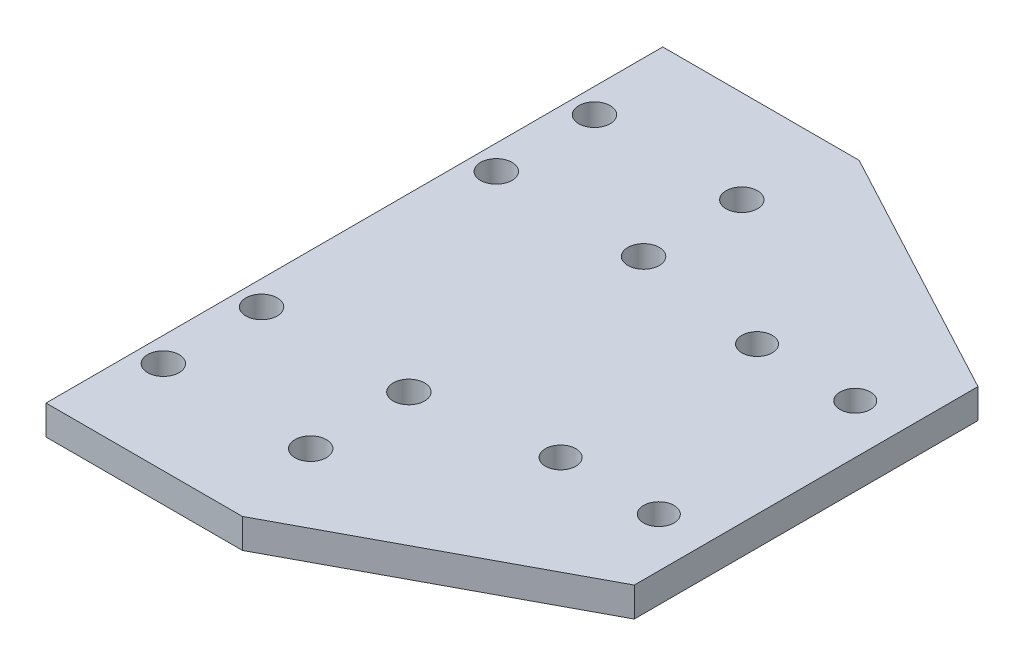
ISO-10303-21;
HEADER;
FILE_DESCRIPTION(('STEP AP214'),'2;1');
FILE_NAME('part.step','',(''),(''),'','','');
FILE_SCHEMA(('AUTOMOTIVE_DESIGN { 1 0 10303 214 1 1 1 1 }'));
ENDSEC;
DATA;
#1=APPLICATION_CONTEXT('core data for automotive mechanical design processes');
#2=APPLICATION_PROTOCOL_DEFINITION('international standard','automotive_design',2000,#1);
#3=PRODUCT_CONTEXT('',#1,'mechanical');
#4=PRODUCT('Part','Part','',(#3));
#5=PRODUCT_RELATED_PRODUCT_CATEGORY('part','',(#4));
#6=PRODUCT_DEFINITION_FORMATION('','',#4);
#7=PRODUCT_DEFINITION_CONTEXT('part definition',#1,'design');
#8=PRODUCT_DEFINITION('design','',#6,#7);
#9=PRODUCT_DEFINITION_SHAPE('','',#8);
#10=(LENGTH_UNIT() NAMED_UNIT(*) SI_UNIT(.MILLI.,.METRE.));
#11=(NAMED_UNIT(*) PLANE_ANGLE_UNIT() SI_UNIT($,.RADIAN.));
#12=(NAMED_UNIT(*) SI_UNIT($,.STERADIAN.) SOLID_ANGLE_UNIT());
#13=UNCERTAINTY_MEASURE_WITH_UNIT(LENGTH_MEASURE(1.E-05),#10,'distance_accuracy_value','');
#14=(GEOMETRIC_REPRESENTATION_CONTEXT(3) GLOBAL_UNCERTAINTY_ASSIGNED_CONTEXT((#13)) GLOBAL_UNIT_ASSIGNED_CONTEXT((#10,
#11,#12)) REPRESENTATION_CONTEXT('',''));
#15=CARTESIAN_POINT('',(0.,0.,0.));
#16=DIRECTION('',(0.,0.,1.));
#17=DIRECTION('',(1.,0.,0.));
#18=AXIS2_PLACEMENT_3D('',#15,#16,#17);
#19=CARTESIAN_POINT('',(-50.,3.,0.));
#20=DIRECTION('',(-1.,0.,0.));
#21=DIRECTION('',(0.,0.,1.));
#22=AXIS2_PLACEMENT_3D('',#19,#20,#21);
#23=PLANE('',#22);
#24=DIRECTION('',(0.,0.,-1.));
#25=VECTOR('',#24,1.);
#26=CARTESIAN_POINT('',(-50.,0.,0.));
#27=LINE('',#26,#25);
#28=CARTESIAN_POINT('',(-50.,0.,31.4));
#29=VERTEX_POINT('',#28);
#30=CARTESIAN_POINT('',(-50.,0.,-31.4));
#31=VERTEX_POINT('',#30);
#32=EDGE_CURVE('E184',#29,#31,#27,.T.);
#33=ORIENTED_EDGE('',*,*,#32,.F.);
#34=DIRECTION('',(0.,-1.,0.));
#35=VECTOR('',#34,1.);
#36=CARTESIAN_POINT('',(-50.,3.,31.4));
#37=LINE('',#36,#35);
#38=CARTESIAN_POINT('',(-50.,3.,31.4));
#39=VERTEX_POINT('',#38);
#40=EDGE_CURVE('E11',#39,#29,#37,.T.);
#41=ORIENTED_EDGE('',*,*,#40,.F.);
#42=DIRECTION('',(0.,0.,-1.));
#43=VECTOR('',#42,1.);
#44=CARTESIAN_POINT('',(-50.,3.,0.));
#45=LINE('',#44,#43);
#46=CARTESIAN_POINT('',(-50.,3.,-31.4));
#47=VERTEX_POINT('',#46);
#48=EDGE_CURVE('E538',#39,#47,#45,.T.);
#49=ORIENTED_EDGE('',*,*,#48,.T.);
#50=DIRECTION('',(0.,-1.,0.));
#51=VECTOR('',#50,1.);
#52=CARTESIAN_POINT('',(-50.,3.,-31.4));
#53=LINE('',#52,#51);
#54=EDGE_CURVE('E66',#47,#31,#53,.T.);
#55=ORIENTED_EDGE('',*,*,#54,.T.);
#56=EDGE_LOOP('',(#33,#41,#49,#55));
#57=FACE_BOUND('',#56,.T.);
#58=ADVANCED_FACE('F48',(#57),#23,.T.);
#59=CARTESIAN_POINT('',(0.,3.,31.4));
#60=DIRECTION('',(0.,0.,-1.));
#61=DIRECTION('',(-1.,0.,0.));
#62=AXIS2_PLACEMENT_3D('',#59,#60,#61);
#63=PLANE('',#62);
#64=DIRECTION('',(1.,0.,0.));
#65=VECTOR('',#64,1.);
#66=CARTESIAN_POINT('',(0.,0.,31.4));
#67=LINE('',#66,#65);
#68=CARTESIAN_POINT('',(-30.,0.,31.4));
#69=VERTEX_POINT('',#68);
#70=EDGE_CURVE('E187',#29,#69,#67,.T.);
#71=ORIENTED_EDGE('',*,*,#70,.T.);
#72=DIRECTION('',(0.,-1.,0.));
#73=VECTOR('',#72,1.);
#74=CARTESIAN_POINT('',(-30.,3.,31.4));
#75=LINE('',#74,#73);
#76=CARTESIAN_POINT('',(-30.,3.,31.4));
#77=VERTEX_POINT('',#76);
#78=EDGE_CURVE('E58',#77,#69,#75,.T.);
#79=ORIENTED_EDGE('',*,*,#78,.F.);
#80=DIRECTION('',(1.,0.,0.));
#81=VECTOR('',#80,1.);
#82=CARTESIAN_POINT('',(0.,3.,31.4));
#83=LINE('',#82,#81);
#84=EDGE_CURVE('E542',#39,#77,#83,.T.);
#85=ORIENTED_EDGE('',*,*,#84,.F.);
#86=ORIENTED_EDGE('',*,*,#40,.T.);
#87=EDGE_LOOP('',(#71,#79,#85,#86));
#88=FACE_BOUND('',#87,.T.);
#89=ADVANCED_FACE('F249',(#88),#63,.F.);
#90=CARTESIAN_POINT('',(6.38701809689258,3.,11.9469403251228));
#91=DIRECTION('',(0.471468241051821,0.,0.881883040816356));
#92=DIRECTION('',(0.881883040816356,0.,-0.471468241051821));
#93=AXIS2_PLACEMENT_3D('',#90,#91,#92);
#94=PLANE('',#93);
#95=DIRECTION('',(-0.881883040816356,0.,0.471468241051821));
#96=VECTOR('',#95,1.);
#97=CARTESIAN_POINT('',(6.38701809689258,0.,11.9469403251228));
#98=LINE('',#97,#96);
#99=CARTESIAN_POINT('',(-4.,0.,17.5));
#100=VERTEX_POINT('',#99);
#101=EDGE_CURVE('E191',#100,#69,#98,.T.);
#102=ORIENTED_EDGE('',*,*,#101,.F.);
#103=DIRECTION('',(0.,-1.,0.));
#104=VECTOR('',#103,1.);
#105=CARTESIAN_POINT('',(-4.,3.,17.5));
#106=LINE('',#105,#104);
#107=CARTESIAN_POINT('',(-4.,3.,17.5));
#108=VERTEX_POINT('',#107);
#109=EDGE_CURVE('E114',#108,#100,#106,.T.);
#110=ORIENTED_EDGE('',*,*,#109,.F.);
#111=DIRECTION('',(-0.881883040816356,0.,0.471468241051821));
#112=VECTOR('',#111,1.);
#113=CARTESIAN_POINT('',(6.38701809689258,3.,11.9469403251228));
#114=LINE('',#113,#112);
#115=EDGE_CURVE('E125',#108,#77,#114,.T.);
#116=ORIENTED_EDGE('',*,*,#115,.T.);
#117=ORIENTED_EDGE('',*,*,#78,.T.);
#118=EDGE_LOOP('',(#102,#110,#116,#117));
#119=FACE_BOUND('',#118,.T.);
#120=ADVANCED_FACE('F246',(#119),#94,.T.);
#121=CARTESIAN_POINT('',(-4.,3.,0.));
#122=DIRECTION('',(1.,0.,0.));
#123=DIRECTION('',(0.,0.,-1.));
#124=AXIS2_PLACEMENT_3D('',#121,#122,#123);
#125=PLANE('',#124);
#126=DIRECTION('',(0.,0.,1.));
#127=VECTOR('',#126,1.);
#128=CARTESIAN_POINT('',(-4.,0.,0.));
#129=LINE('',#128,#127);
#130=CARTESIAN_POINT('',(-4.,0.,-17.5));
#131=VERTEX_POINT('',#130);
#132=EDGE_CURVE('E109',#131,#100,#129,.T.);
#133=ORIENTED_EDGE('',*,*,#132,.F.);
#134=DIRECTION('',(0.,-1.,0.));
#135=VECTOR('',#134,1.);
#136=CARTESIAN_POINT('',(-4.,3.,-17.5));
#137=LINE('',#136,#135);
#138=CARTESIAN_POINT('',(-4.,3.,-17.5));
#139=VERTEX_POINT('',#138);
#140=EDGE_CURVE('E104',#139,#131,#137,.T.);
#141=ORIENTED_EDGE('',*,*,#140,.F.);
#142=DIRECTION('',(0.,0.,1.));
#143=VECTOR('',#142,1.);
#144=CARTESIAN_POINT('',(-4.,3.,0.));
#145=LINE('',#144,#143);
#146=EDGE_CURVE('E107',#139,#108,#145,.T.);
#147=ORIENTED_EDGE('',*,*,#146,.T.);
#148=ORIENTED_EDGE('',*,*,#109,.T.);
#149=EDGE_LOOP('',(#133,#141,#147,#148));
#150=FACE_BOUND('',#149,.T.);
#151=ADVANCED_FACE('F106',(#150),#125,.T.);
#152=CARTESIAN_POINT('',(6.38701809689258,3.,-11.9469403251228));
#153=DIRECTION('',(0.471468241051821,0.,-0.881883040816356));
#154=DIRECTION('',(-0.881883040816356,0.,-0.471468241051821));
#155=AXIS2_PLACEMENT_3D('',#152,#153,#154);
#156=PLANE('',#155);
#157=DIRECTION('',(0.881883040816356,0.,0.471468241051821));
#158=VECTOR('',#157,1.);
#159=CARTESIAN_POINT('',(6.38701809689258,0.,-11.9469403251228));
#160=LINE('',#159,#158);
#161=CARTESIAN_POINT('',(-30.,0.,-31.4));
#162=VERTEX_POINT('',#161);
#163=EDGE_CURVE('E197',#162,#131,#160,.T.);
#164=ORIENTED_EDGE('',*,*,#163,.F.);
#165=DIRECTION('',(0.,-1.,0.));
#166=VECTOR('',#165,1.);
#167=CARTESIAN_POINT('',(-30.,3.,-31.4));
#168=LINE('',#167,#166);
#169=CARTESIAN_POINT('',(-30.,3.,-31.4));
#170=VERTEX_POINT('',#169);
#171=EDGE_CURVE('E85',#170,#162,#168,.T.);
#172=ORIENTED_EDGE('',*,*,#171,.F.);
#173=DIRECTION('',(0.881883040816356,0.,0.471468241051821));
#174=VECTOR('',#173,1.);
#175=CARTESIAN_POINT('',(6.38701809689258,3.,-11.9469403251228));
#176=LINE('',#175,#174);
#177=EDGE_CURVE('E123',#170,#139,#176,.T.);
#178=ORIENTED_EDGE('',*,*,#177,.T.);
#179=ORIENTED_EDGE('',*,*,#140,.T.);
#180=EDGE_LOOP('',(#164,#172,#178,#179));
#181=FACE_BOUND('',#180,.T.);
#182=ADVANCED_FACE('F128',(#181),#156,.T.);
#183=CARTESIAN_POINT('',(-47.5,3.,21.95));
#184=DIRECTION('',(0.,-1.,0.));
#185=DIRECTION('',(0.,0.,-1.));
#186=AXIS2_PLACEMENT_3D('',#183,#184,#185);
#187=CYLINDRICAL_SURFACE('',#186,1.6);
#188=CARTESIAN_POINT('',(-47.5,3.,21.95));
#189=DIRECTION('',(0.,1.,0.));
#190=DIRECTION('',(0.,0.,1.));
#191=AXIS2_PLACEMENT_3D('',#188,#189,#190);
#192=CIRCLE('',#191,1.6);
#193=CARTESIAN_POINT('',(-47.5,3.,23.55));
#194=VERTEX_POINT('',#193);
#195=EDGE_CURVE('E160',#194,#194,#192,.F.);
#196=ORIENTED_EDGE('',*,*,#195,.F.);
#197=EDGE_LOOP('',(#196));
#198=FACE_BOUND('',#197,.T.);
#199=CARTESIAN_POINT('',(-47.5,0.,21.95));
#200=DIRECTION('',(0.,1.,0.));
#201=DIRECTION('',(0.,0.,1.));
#202=AXIS2_PLACEMENT_3D('',#199,#200,#201);
#203=CIRCLE('',#202,1.6);
#204=CARTESIAN_POINT('',(-47.5,0.,23.55));
#205=VERTEX_POINT('',#204);
#206=EDGE_CURVE('E228',#205,#205,#203,.F.);
#207=ORIENTED_EDGE('',*,*,#206,.T.);
#208=EDGE_LOOP('',(#207));
#209=FACE_BOUND('',#208,.T.);
#210=ADVANCED_FACE('F312',(#198,#209),#187,.F.);
#211=CARTESIAN_POINT('',(-47.5,3.,11.95));
#212=DIRECTION('',(0.,-1.,0.));
#213=DIRECTION('',(0.,0.,-1.));
#214=AXIS2_PLACEMENT_3D('',#211,#212,#213);
#215=CYLINDRICAL_SURFACE('',#214,1.6);
#216=CARTESIAN_POINT('',(-47.5,3.,11.95));
#217=DIRECTION('',(0.,1.,0.));
#218=DIRECTION('',(0.,0.,1.));
#219=AXIS2_PLACEMENT_3D('',#216,#217,#218);
#220=CIRCLE('',#219,1.6);
#221=CARTESIAN_POINT('',(-47.5,3.,13.55));
#222=VERTEX_POINT('',#221);
#223=EDGE_CURVE('E156',#222,#222,#220,.F.);
#224=ORIENTED_EDGE('',*,*,#223,.F.);
#225=EDGE_LOOP('',(#224));
#226=FACE_BOUND('',#225,.T.);
#227=CARTESIAN_POINT('',(-47.5,0.,11.95));
#228=DIRECTION('',(0.,1.,0.));
#229=DIRECTION('',(0.,0.,1.));
#230=AXIS2_PLACEMENT_3D('',#227,#228,#229);
#231=CIRCLE('',#230,1.6);
#232=CARTESIAN_POINT('',(-47.5,0.,13.55));
#233=VERTEX_POINT('',#232);
#234=EDGE_CURVE('E224',#233,#233,#231,.F.);
#235=ORIENTED_EDGE('',*,*,#234,.T.);
#236=EDGE_LOOP('',(#235));
#237=FACE_BOUND('',#236,.T.);
#238=ADVANCED_FACE('F315',(#226,#237),#215,.F.);
#239=CARTESIAN_POINT('',(-32.5,3.,11.95));
#240=DIRECTION('',(0.,-1.,0.));
#241=DIRECTION('',(0.,0.,-1.));
#242=AXIS2_PLACEMENT_3D('',#239,#240,#241);
#243=CYLINDRICAL_SURFACE('',#242,1.6);
#244=CARTESIAN_POINT('',(-32.5,3.,11.95));
#245=DIRECTION('',(0.,1.,0.));
#246=DIRECTION('',(0.,0.,1.));
#247=AXIS2_PLACEMENT_3D('',#244,#245,#246);
#248=CIRCLE('',#247,1.6);
#249=CARTESIAN_POINT('',(-32.5,3.,13.55));
#250=VERTEX_POINT('',#249);
#251=EDGE_CURVE('E152',#250,#250,#248,.F.);
#252=ORIENTED_EDGE('',*,*,#251,.F.);
#253=EDGE_LOOP('',(#252));
#254=FACE_BOUND('',#253,.T.);
#255=CARTESIAN_POINT('',(-32.5,0.,11.95));
#256=DIRECTION('',(0.,1.,0.));
#257=DIRECTION('',(0.,0.,1.));
#258=AXIS2_PLACEMENT_3D('',#255,#256,#257);
#259=CIRCLE('',#258,1.6);
#260=CARTESIAN_POINT('',(-32.5,0.,13.55));
#261=VERTEX_POINT('',#260);
#262=EDGE_CURVE('E220',#261,#261,#259,.F.);
#263=ORIENTED_EDGE('',*,*,#262,.T.);
#264=EDGE_LOOP('',(#263));
#265=FACE_BOUND('',#264,.T.);
#266=ADVANCED_FACE('F319',(#254,#265),#243,.F.);
#267=CARTESIAN_POINT('',(-32.5,3.,-11.95));
#268=DIRECTION('',(0.,-1.,0.));
#269=DIRECTION('',(0.,0.,-1.));
#270=AXIS2_PLACEMENT_3D('',#267,#268,#269);
#271=CYLINDRICAL_SURFACE('',#270,1.6);
#272=CARTESIAN_POINT('',(-32.5,3.,-11.95));
#273=DIRECTION('',(0.,1.,0.));
#274=DIRECTION('',(0.,0.,1.));
#275=AXIS2_PLACEMENT_3D('',#272,#273,#274);
#276=CIRCLE('',#275,1.6);
#277=CARTESIAN_POINT('',(-32.5,3.,-10.35));
#278=VERTEX_POINT('',#277);
#279=EDGE_CURVE('E148',#278,#278,#276,.T.);
#280=ORIENTED_EDGE('',*,*,#279,.T.);
#281=EDGE_LOOP('',(#280));
#282=FACE_BOUND('',#281,.T.);
#283=CARTESIAN_POINT('',(-32.5,0.,-11.95));
#284=DIRECTION('',(0.,1.,0.));
#285=DIRECTION('',(0.,0.,1.));
#286=AXIS2_PLACEMENT_3D('',#283,#284,#285);
#287=CIRCLE('',#286,1.6);
#288=CARTESIAN_POINT('',(-32.5,0.,-10.35));
#289=VERTEX_POINT('',#288);
#290=EDGE_CURVE('E216',#289,#289,#287,.T.);
#291=ORIENTED_EDGE('',*,*,#290,.F.);
#292=EDGE_LOOP('',(#291));
#293=FACE_BOUND('',#292,.T.);
#294=ADVANCED_FACE('F323',(#282,#293),#271,.F.);
#295=CARTESIAN_POINT('',(-47.5,3.,-11.95));
#296=DIRECTION('',(0.,-1.,0.));
#297=DIRECTION('',(0.,0.,-1.));
#298=AXIS2_PLACEMENT_3D('',#295,#296,#297);
#299=CYLINDRICAL_SURFACE('',#298,1.6);
#300=CARTESIAN_POINT('',(-47.5,3.,-11.95));
#301=DIRECTION('',(0.,1.,0.));
#302=DIRECTION('',(0.,0.,1.));
#303=AXIS2_PLACEMENT_3D('',#300,#301,#302);
#304=CIRCLE('',#303,1.6);
#305=CARTESIAN_POINT('',(-47.5,3.,-10.35));
#306=VERTEX_POINT('',#305);
#307=EDGE_CURVE('E144',#306,#306,#304,.T.);
#308=ORIENTED_EDGE('',*,*,#307,.T.);
#309=EDGE_LOOP('',(#308));
#310=FACE_BOUND('',#309,.T.);
#311=CARTESIAN_POINT('',(-47.5,0.,-11.95));
#312=DIRECTION('',(0.,1.,0.));
#313=DIRECTION('',(0.,0.,1.));
#314=AXIS2_PLACEMENT_3D('',#311,#312,#313);
#315=CIRCLE('',#314,1.6);
#316=CARTESIAN_POINT('',(-47.5,0.,-10.35));
#317=VERTEX_POINT('',#316);
#318=EDGE_CURVE('E212',#317,#317,#315,.T.);
#319=ORIENTED_EDGE('',*,*,#318,.F.);
#320=EDGE_LOOP('',(#319));
#321=FACE_BOUND('',#320,.T.);
#322=ADVANCED_FACE('F327',(#310,#321),#299,.F.);
#323=CARTESIAN_POINT('',(-32.5,3.,-21.95));
#324=DIRECTION('',(0.,-1.,0.));
#325=DIRECTION('',(0.,0.,-1.));
#326=AXIS2_PLACEMENT_3D('',#323,#324,#325);
#327=CYLINDRICAL_SURFACE('',#326,1.6);
#328=CARTESIAN_POINT('',(-32.5,3.,-21.95));
#329=DIRECTION('',(0.,1.,0.));
#330=DIRECTION('',(0.,0.,1.));
#331=AXIS2_PLACEMENT_3D('',#328,#329,#330);
#332=CIRCLE('',#331,1.6);
#333=CARTESIAN_POINT('',(-32.5,3.,-20.35));
#334=VERTEX_POINT('',#333);
#335=EDGE_CURVE('E140',#334,#334,#332,.T.);
#336=ORIENTED_EDGE('',*,*,#335,.T.);
#337=EDGE_LOOP('',(#336));
#338=FACE_BOUND('',#337,.T.);
#339=CARTESIAN_POINT('',(-32.5,0.,-21.95));
#340=DIRECTION('',(0.,1.,0.));
#341=DIRECTION('',(0.,0.,1.));
#342=AXIS2_PLACEMENT_3D('',#339,#340,#341);
#343=CIRCLE('',#342,1.6);
#344=CARTESIAN_POINT('',(-32.5,0.,-20.35));
#345=VERTEX_POINT('',#344);
#346=EDGE_CURVE('E208',#345,#345,#343,.T.);
#347=ORIENTED_EDGE('',*,*,#346,.F.);
#348=EDGE_LOOP('',(#347));
#349=FACE_BOUND('',#348,.T.);
#350=ADVANCED_FACE('F265',(#338,#349),#327,.F.);
#351=CARTESIAN_POINT('',(-47.5,3.,-21.95));
#352=DIRECTION('',(0.,-1.,0.));
#353=DIRECTION('',(0.,0.,-1.));
#354=AXIS2_PLACEMENT_3D('',#351,#352,#353);
#355=CYLINDRICAL_SURFACE('',#354,1.6);
#356=CARTESIAN_POINT('',(-47.5,3.,-21.95));
#357=DIRECTION('',(0.,1.,0.));
#358=DIRECTION('',(0.,0.,1.));
#359=AXIS2_PLACEMENT_3D('',#356,#357,#358);
#360=CIRCLE('',#359,1.6);
#361=CARTESIAN_POINT('',(-47.5,3.,-20.35));
#362=VERTEX_POINT('',#361);
#363=EDGE_CURVE('E133',#362,#362,#360,.T.);
#364=ORIENTED_EDGE('',*,*,#363,.T.);
#365=EDGE_LOOP('',(#364));
#366=FACE_BOUND('',#365,.T.);
#367=CARTESIAN_POINT('',(-47.5,0.,-21.95));
#368=DIRECTION('',(0.,1.,0.));
#369=DIRECTION('',(0.,0.,1.));
#370=AXIS2_PLACEMENT_3D('',#367,#368,#369);
#371=CIRCLE('',#370,1.6);
#372=CARTESIAN_POINT('',(-47.5,0.,-20.35));
#373=VERTEX_POINT('',#372);
#374=EDGE_CURVE('E204',#373,#373,#371,.T.);
#375=ORIENTED_EDGE('',*,*,#374,.F.);
#376=EDGE_LOOP('',(#375));
#377=FACE_BOUND('',#376,.T.);
#378=ADVANCED_FACE('F256',(#366,#377),#355,.F.);
#379=CARTESIAN_POINT('',(0.,3.,-31.4));
#380=DIRECTION('',(0.,0.,-1.));
#381=DIRECTION('',(-1.,0.,0.));
#382=AXIS2_PLACEMENT_3D('',#379,#380,#381);
#383=PLANE('',#382);
#384=DIRECTION('',(1.,0.,0.));
#385=VECTOR('',#384,1.);
#386=CARTESIAN_POINT('',(0.,0.,-31.4));
#387=LINE('',#386,#385);
#388=EDGE_CURVE('E200',#31,#162,#387,.T.);
#389=ORIENTED_EDGE('',*,*,#388,.F.);
#390=ORIENTED_EDGE('',*,*,#54,.F.);
#391=DIRECTION('',(1.,0.,0.));
#392=VECTOR('',#391,1.);
#393=CARTESIAN_POINT('',(0.,3.,-31.4));
#394=LINE('',#393,#392);
#395=EDGE_CURVE('E130',#47,#170,#394,.T.);
#396=ORIENTED_EDGE('',*,*,#395,.T.);
#397=ORIENTED_EDGE('',*,*,#171,.T.);
#398=EDGE_LOOP('',(#389,#390,#396,#397));
#399=FACE_BOUND('',#398,.T.);
#400=ADVANCED_FACE('F253',(#399),#383,.T.);
#401=CARTESIAN_POINT('',(-32.5,3.,21.95));
#402=DIRECTION('',(0.,-1.,0.));
#403=DIRECTION('',(0.,0.,-1.));
#404=AXIS2_PLACEMENT_3D('',#401,#402,#403);
#405=CYLINDRICAL_SURFACE('',#404,1.6);
#406=CARTESIAN_POINT('',(-32.5,3.,21.95));
#407=DIRECTION('',(0.,1.,0.));
#408=DIRECTION('',(0.,0.,1.));
#409=AXIS2_PLACEMENT_3D('',#406,#407,#408);
#410=CIRCLE('',#409,1.6);
#411=CARTESIAN_POINT('',(-32.5,3.,23.55));
#412=VERTEX_POINT('',#411);
#413=EDGE_CURVE('E536',#412,#412,#410,.F.);
#414=ORIENTED_EDGE('',*,*,#413,.F.);
#415=EDGE_LOOP('',(#414));
#416=FACE_BOUND('',#415,.T.);
#417=CARTESIAN_POINT('',(-32.5,0.,21.95));
#418=DIRECTION('',(0.,1.,0.));
#419=DIRECTION('',(0.,0.,1.));
#420=AXIS2_PLACEMENT_3D('',#417,#418,#419);
#421=CIRCLE('',#420,1.6);
#422=CARTESIAN_POINT('',(-32.5,0.,23.55));
#423=VERTEX_POINT('',#422);
#424=EDGE_CURVE('E180',#423,#423,#421,.F.);
#425=ORIENTED_EDGE('',*,*,#424,.T.);
#426=EDGE_LOOP('',(#425));
#427=FACE_BOUND('',#426,.T.);
#428=ADVANCED_FACE('F255',(#416,#427),#405,.F.);
#429=CARTESIAN_POINT('',(-19.,3.,-10.));
#430=DIRECTION('',(0.,-1.,0.));
#431=DIRECTION('',(0.,0.,-1.));
#432=AXIS2_PLACEMENT_3D('',#429,#430,#431);
#433=CYLINDRICAL_SURFACE('',#432,1.55);
#434=CARTESIAN_POINT('',(-19.,3.,-10.));
#435=DIRECTION('',(0.,1.,0.));
#436=DIRECTION('',(0.,0.,1.));
#437=AXIS2_PLACEMENT_3D('',#434,#435,#436);
#438=CIRCLE('',#437,1.55);
#439=CARTESIAN_POINT('',(-19.,3.,-8.45));
#440=VERTEX_POINT('',#439);
#441=EDGE_CURVE('E533',#440,#440,#438,.T.);
#442=ORIENTED_EDGE('',*,*,#441,.T.);
#443=EDGE_LOOP('',(#442));
#444=FACE_BOUND('',#443,.T.);
#445=CARTESIAN_POINT('',(-19.,0.,-10.));
#446=DIRECTION('',(0.,1.,0.));
#447=DIRECTION('',(0.,0.,1.));
#448=AXIS2_PLACEMENT_3D('',#445,#446,#447);
#449=CIRCLE('',#448,1.55);
#450=CARTESIAN_POINT('',(-19.,0.,-8.45));
#451=VERTEX_POINT('',#450);
#452=EDGE_CURVE('E176',#451,#451,#449,.T.);
#453=ORIENTED_EDGE('',*,*,#452,.F.);
#454=EDGE_LOOP('',(#453));
#455=FACE_BOUND('',#454,.T.);
#456=ADVANCED_FACE('F262',(#444,#455),#433,.F.);
#457=CARTESIAN_POINT('',(-9.00000000000001,3.,-10.));
#458=DIRECTION('',(0.,-1.,0.));
#459=DIRECTION('',(0.,0.,-1.));
#460=AXIS2_PLACEMENT_3D('',#457,#458,#459);
#461=CYLINDRICAL_SURFACE('',#460,1.55);
#462=CARTESIAN_POINT('',(-9.00000000000001,3.,-10.));
#463=DIRECTION('',(0.,1.,0.));
#464=DIRECTION('',(0.,0.,1.));
#465=AXIS2_PLACEMENT_3D('',#462,#463,#464);
#466=CIRCLE('',#465,1.55);
#467=CARTESIAN_POINT('',(-9.00000000000001,3.,-8.45));
#468=VERTEX_POINT('',#467);
#469=EDGE_CURVE('E290',#468,#468,#466,.T.);
#470=ORIENTED_EDGE('',*,*,#469,.T.);
#471=EDGE_LOOP('',(#470));
#472=FACE_BOUND('',#471,.T.);
#473=CARTESIAN_POINT('',(-9.00000000000001,0.,-10.));
#474=DIRECTION('',(0.,1.,0.));
#475=DIRECTION('',(0.,0.,1.));
#476=AXIS2_PLACEMENT_3D('',#473,#474,#475);
#477=CIRCLE('',#476,1.55);
#478=CARTESIAN_POINT('',(-9.00000000000001,0.,-8.45));
#479=VERTEX_POINT('',#478);
#480=EDGE_CURVE('E172',#479,#479,#477,.T.);
#481=ORIENTED_EDGE('',*,*,#480,.F.);
#482=EDGE_LOOP('',(#481));
#483=FACE_BOUND('',#482,.T.);
#484=ADVANCED_FACE('F278',(#472,#483),#461,.F.);
#485=CARTESIAN_POINT('',(-9.00000000000001,3.,10.));
#486=DIRECTION('',(0.,-1.,0.));
#487=DIRECTION('',(0.,0.,-1.));
#488=AXIS2_PLACEMENT_3D('',#485,#486,#487);
#489=CYLINDRICAL_SURFACE('',#488,1.55);
#490=CARTESIAN_POINT('',(-9.00000000000001,3.,10.));
#491=DIRECTION('',(0.,1.,0.));
#492=DIRECTION('',(0.,0.,1.));
#493=AXIS2_PLACEMENT_3D('',#490,#491,#492);
#494=CIRCLE('',#493,1.55);
#495=CARTESIAN_POINT('',(-9.00000000000001,3.,11.55));
#496=VERTEX_POINT('',#495);
#497=EDGE_CURVE('E236',#496,#496,#494,.F.);
#498=ORIENTED_EDGE('',*,*,#497,.F.);
#499=EDGE_LOOP('',(#498));
#500=FACE_BOUND('',#499,.T.);
#501=CARTESIAN_POINT('',(-9.00000000000001,0.,10.));
#502=DIRECTION('',(0.,1.,0.));
#503=DIRECTION('',(0.,0.,1.));
#504=AXIS2_PLACEMENT_3D('',#501,#502,#503);
#505=CIRCLE('',#504,1.55);
#506=CARTESIAN_POINT('',(-9.00000000000001,0.,11.55));
#507=VERTEX_POINT('',#506);
#508=EDGE_CURVE('E168',#507,#507,#505,.F.);
#509=ORIENTED_EDGE('',*,*,#508,.T.);
#510=EDGE_LOOP('',(#509));
#511=FACE_BOUND('',#510,.T.);
#512=ADVANCED_FACE('F50',(#500,#511),#489,.F.);
#513=CARTESIAN_POINT('',(-19.,3.,10.));
#514=DIRECTION('',(0.,-1.,0.));
#515=DIRECTION('',(0.,0.,-1.));
#516=AXIS2_PLACEMENT_3D('',#513,#514,#515);
#517=CYLINDRICAL_SURFACE('',#516,1.55);
#518=CARTESIAN_POINT('',(-19.,3.,10.));
#519=DIRECTION('',(0.,1.,0.));
#520=DIRECTION('',(0.,0.,1.));
#521=AXIS2_PLACEMENT_3D('',#518,#519,#520);
#522=CIRCLE('',#521,1.55);
#523=CARTESIAN_POINT('',(-19.,3.,11.55));
#524=VERTEX_POINT('',#523);
#525=EDGE_CURVE('E164',#524,#524,#522,.F.);
#526=ORIENTED_EDGE('',*,*,#525,.F.);
#527=EDGE_LOOP('',(#526));
#528=FACE_BOUND('',#527,.T.);
#529=CARTESIAN_POINT('',(-19.,0.,10.));
#530=DIRECTION('',(0.,1.,0.));
#531=DIRECTION('',(0.,0.,1.));
#532=AXIS2_PLACEMENT_3D('',#529,#530,#531);
#533=CIRCLE('',#532,1.55);
#534=CARTESIAN_POINT('',(-19.,0.,11.55));
#535=VERTEX_POINT('',#534);
#536=EDGE_CURVE('E232',#535,#535,#533,.F.);
#537=ORIENTED_EDGE('',*,*,#536,.T.);
#538=EDGE_LOOP('',(#537));
#539=FACE_BOUND('',#538,.T.);
#540=ADVANCED_FACE('F285',(#528,#539),#517,.F.);
#541=CARTESIAN_POINT('',(0.,3.,0.));
#542=DIRECTION('',(0.,1.,0.));
#543=DIRECTION('',(0.,0.,1.));
#544=AXIS2_PLACEMENT_3D('',#541,#542,#543);
#545=PLANE('',#544);
#546=ORIENTED_EDGE('',*,*,#497,.T.);
#547=EDGE_LOOP('',(#546));
#548=FACE_BOUND('',#547,.T.);
#549=ORIENTED_EDGE('',*,*,#469,.F.);
#550=EDGE_LOOP('',(#549));
#551=FACE_BOUND('',#550,.T.);
#552=ORIENTED_EDGE('',*,*,#441,.F.);
#553=EDGE_LOOP('',(#552));
#554=FACE_BOUND('',#553,.T.);
#555=ORIENTED_EDGE('',*,*,#413,.T.);
#556=EDGE_LOOP('',(#555));
#557=FACE_BOUND('',#556,.T.);
#558=ORIENTED_EDGE('',*,*,#48,.F.);
#559=ORIENTED_EDGE('',*,*,#84,.T.);
#560=ORIENTED_EDGE('',*,*,#115,.F.);
#561=ORIENTED_EDGE('',*,*,#146,.F.);
#562=ORIENTED_EDGE('',*,*,#177,.F.);
#563=ORIENTED_EDGE('',*,*,#395,.F.);
#564=EDGE_LOOP('',(#558,#559,#560,#561,#562,#563));
#565=FACE_BOUND('',#564,.T.);
#566=ORIENTED_EDGE('',*,*,#363,.F.);
#567=EDGE_LOOP('',(#566));
#568=FACE_BOUND('',#567,.T.);
#569=ORIENTED_EDGE('',*,*,#335,.F.);
#570=EDGE_LOOP('',(#569));
#571=FACE_BOUND('',#570,.T.);
#572=ORIENTED_EDGE('',*,*,#307,.F.);
#573=EDGE_LOOP('',(#572));
#574=FACE_BOUND('',#573,.T.);
#575=ORIENTED_EDGE('',*,*,#279,.F.);
#576=EDGE_LOOP('',(#575));
#577=FACE_BOUND('',#576,.T.);
#578=ORIENTED_EDGE('',*,*,#251,.T.);
#579=EDGE_LOOP('',(#578));
#580=FACE_BOUND('',#579,.T.);
#581=ORIENTED_EDGE('',*,*,#223,.T.);
#582=EDGE_LOOP('',(#581));
#583=FACE_BOUND('',#582,.T.);
#584=ORIENTED_EDGE('',*,*,#195,.T.);
#585=EDGE_LOOP('',(#584));
#586=FACE_BOUND('',#585,.T.);
#587=ORIENTED_EDGE('',*,*,#525,.T.);
#588=EDGE_LOOP('',(#587));
#589=FACE_BOUND('',#588,.T.);
#590=ADVANCED_FACE('F120',(#548,#551,#554,#557,#565,#568,#571,#574,#577,#580,#583,#586,#589),
#545,.T.);
#591=CARTESIAN_POINT('',(0.,0.,0.));
#592=DIRECTION('',(0.,1.,0.));
#593=DIRECTION('',(0.,0.,1.));
#594=AXIS2_PLACEMENT_3D('',#591,#592,#593);
#595=PLANE('',#594);
#596=ORIENTED_EDGE('',*,*,#508,.F.);
#597=EDGE_LOOP('',(#596));
#598=FACE_BOUND('',#597,.T.);
#599=ORIENTED_EDGE('',*,*,#480,.T.);
#600=EDGE_LOOP('',(#599));
#601=FACE_BOUND('',#600,.T.);
#602=ORIENTED_EDGE('',*,*,#452,.T.);
#603=EDGE_LOOP('',(#602));
#604=FACE_BOUND('',#603,.T.);
#605=ORIENTED_EDGE('',*,*,#424,.F.);
#606=EDGE_LOOP('',(#605));
#607=FACE_BOUND('',#606,.T.);
#608=ORIENTED_EDGE('',*,*,#32,.T.);
#609=ORIENTED_EDGE('',*,*,#388,.T.);
#610=ORIENTED_EDGE('',*,*,#163,.T.);
#611=ORIENTED_EDGE('',*,*,#132,.T.);
#612=ORIENTED_EDGE('',*,*,#101,.T.);
#613=ORIENTED_EDGE('',*,*,#70,.F.);
#614=EDGE_LOOP('',(#608,#609,#610,#611,#612,#613));
#615=FACE_BOUND('',#614,.T.);
#616=ORIENTED_EDGE('',*,*,#374,.T.);
#617=EDGE_LOOP('',(#616));
#618=FACE_BOUND('',#617,.T.);
#619=ORIENTED_EDGE('',*,*,#346,.T.);
#620=EDGE_LOOP('',(#619));
#621=FACE_BOUND('',#620,.T.);
#622=ORIENTED_EDGE('',*,*,#318,.T.);
#623=EDGE_LOOP('',(#622));
#624=FACE_BOUND('',#623,.T.);
#625=ORIENTED_EDGE('',*,*,#290,.T.);
#626=EDGE_LOOP('',(#625));
#627=FACE_BOUND('',#626,.T.);
#628=ORIENTED_EDGE('',*,*,#262,.F.);
#629=EDGE_LOOP('',(#628));
#630=FACE_BOUND('',#629,.T.);
#631=ORIENTED_EDGE('',*,*,#234,.F.);
#632=EDGE_LOOP('',(#631));
#633=FACE_BOUND('',#632,.T.);
#634=ORIENTED_EDGE('',*,*,#206,.F.);
#635=EDGE_LOOP('',(#634));
#636=FACE_BOUND('',#635,.T.);
#637=ORIENTED_EDGE('',*,*,#536,.F.);
#638=EDGE_LOOP('',(#637));
#639=FACE_BOUND('',#638,.T.);
#640=ADVANCED_FACE('F251',(#598,#601,#604,#607,#615,#618,#621,#624,#627,#630,#633,#636,#639),
#595,.F.);
#641=CLOSED_SHELL('',(#58,#89,#120,#151,#182,#210,#238,#266,#294,#322,#350,#378,#400,#428,#456,
#484,#512,#540,#590,#640));
#642=MANIFOLD_SOLID_BREP('B2',#641);
#643=ADVANCED_BREP_SHAPE_REPRESENTATION('',(#18,#642),#14);
#644=SHAPE_DEFINITION_REPRESENTATION(#9,#643);
ENDSEC;
END-ISO-10303-21;
